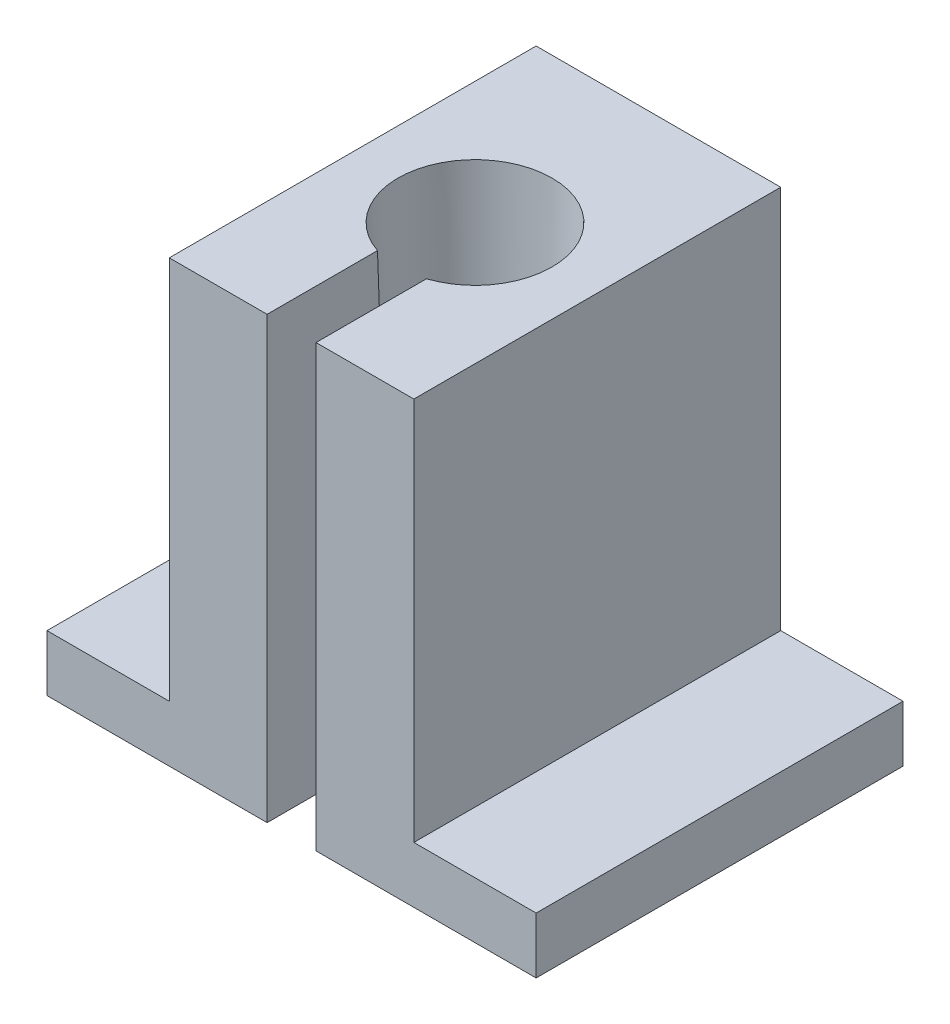
ISO-10303-21;
HEADER;
FILE_DESCRIPTION(('STEP AP214'),'2;1');
FILE_NAME('part.step','',(''),(''),'','','');
FILE_SCHEMA(('AUTOMOTIVE_DESIGN { 1 0 10303 214 1 1 1 1 }'));
ENDSEC;
DATA;
#1=APPLICATION_CONTEXT('core data for automotive mechanical design processes');
#2=APPLICATION_PROTOCOL_DEFINITION('international standard','automotive_design',2000,#1);
#3=PRODUCT_CONTEXT('',#1,'mechanical');
#4=PRODUCT('Part','Part','',(#3));
#5=PRODUCT_RELATED_PRODUCT_CATEGORY('part','',(#4));
#6=PRODUCT_DEFINITION_FORMATION('','',#4);
#7=PRODUCT_DEFINITION_CONTEXT('part definition',#1,'design');
#8=PRODUCT_DEFINITION('design','',#6,#7);
#9=PRODUCT_DEFINITION_SHAPE('','',#8);
#10=(LENGTH_UNIT() NAMED_UNIT(*) SI_UNIT(.MILLI.,.METRE.));
#11=(NAMED_UNIT(*) PLANE_ANGLE_UNIT() SI_UNIT($,.RADIAN.));
#12=(NAMED_UNIT(*) SI_UNIT($,.STERADIAN.) SOLID_ANGLE_UNIT());
#13=UNCERTAINTY_MEASURE_WITH_UNIT(LENGTH_MEASURE(1.E-05),#10,'distance_accuracy_value','');
#14=(GEOMETRIC_REPRESENTATION_CONTEXT(3) GLOBAL_UNCERTAINTY_ASSIGNED_CONTEXT((#13)) GLOBAL_UNIT_ASSIGNED_CONTEXT((#10,
#11,#12)) REPRESENTATION_CONTEXT('',''));
#15=CARTESIAN_POINT('',(0.,0.,0.));
#16=DIRECTION('',(0.,0.,1.));
#17=DIRECTION('',(1.,0.,0.));
#18=AXIS2_PLACEMENT_3D('',#15,#16,#17);
#19=CARTESIAN_POINT('',(0.,0.,15.));
#20=DIRECTION('',(0.,0.,1.));
#21=DIRECTION('',(1.,0.,0.));
#22=AXIS2_PLACEMENT_3D('',#19,#20,#21);
#23=PLANE('',#22);
#24=DIRECTION('',(0.,1.,0.));
#25=VECTOR('',#24,1.);
#26=CARTESIAN_POINT('',(1.,9.,15.));
#27=LINE('',#26,#25);
#28=CARTESIAN_POINT('',(1.,-9.,15.));
#29=VERTEX_POINT('',#28);
#30=CARTESIAN_POINT('',(1.,9.,15.));
#31=VERTEX_POINT('',#30);
#32=EDGE_CURVE('E135',#29,#31,#27,.T.);
#33=ORIENTED_EDGE('',*,*,#32,.F.);
#34=DIRECTION('',(1.,0.,0.));
#35=VECTOR('',#34,1.);
#36=CARTESIAN_POINT('',(-5.,-9.,15.));
#37=LINE('',#36,#35);
#38=CARTESIAN_POINT('',(10.,-9.,15.));
#39=VERTEX_POINT('',#38);
#40=EDGE_CURVE('E170',#29,#39,#37,.T.);
#41=ORIENTED_EDGE('',*,*,#40,.T.);
#42=DIRECTION('',(0.,1.,0.));
#43=VECTOR('',#42,1.);
#44=CARTESIAN_POINT('',(10.,-6.7,15.));
#45=LINE('',#44,#43);
#46=CARTESIAN_POINT('',(10.,-6.7,15.));
#47=VERTEX_POINT('',#46);
#48=EDGE_CURVE('E276',#39,#47,#45,.T.);
#49=ORIENTED_EDGE('',*,*,#48,.T.);
#50=DIRECTION('',(-1.,0.,0.));
#51=VECTOR('',#50,1.);
#52=CARTESIAN_POINT('',(5.,-6.7,15.));
#53=LINE('',#52,#51);
#54=CARTESIAN_POINT('',(5.,-6.7,15.));
#55=VERTEX_POINT('',#54);
#56=EDGE_CURVE('E322',#47,#55,#53,.T.);
#57=ORIENTED_EDGE('',*,*,#56,.T.);
#58=DIRECTION('',(0.,1.,0.));
#59=VECTOR('',#58,1.);
#60=CARTESIAN_POINT('',(5.,9.,15.));
#61=LINE('',#60,#59);
#62=CARTESIAN_POINT('',(5.,9.,15.));
#63=VERTEX_POINT('',#62);
#64=EDGE_CURVE('E162',#55,#63,#61,.T.);
#65=ORIENTED_EDGE('',*,*,#64,.T.);
#66=DIRECTION('',(-1.,0.,0.));
#67=VECTOR('',#66,1.);
#68=CARTESIAN_POINT('',(-5.,9.,15.));
#69=LINE('',#68,#67);
#70=EDGE_CURVE('E153',#63,#31,#69,.T.);
#71=ORIENTED_EDGE('',*,*,#70,.T.);
#72=EDGE_LOOP('',(#33,#41,#49,#57,#65,#71));
#73=FACE_BOUND('',#72,.T.);
#74=ADVANCED_FACE('F45',(#73),#23,.T.);
#75=CARTESIAN_POINT('',(5.,9.,15.));
#76=DIRECTION('',(-1.,0.,0.));
#77=DIRECTION('',(0.,0.,1.));
#78=AXIS2_PLACEMENT_3D('',#75,#76,#77);
#79=PLANE('',#78);
#80=DIRECTION('',(0.,0.,1.));
#81=VECTOR('',#80,1.);
#82=CARTESIAN_POINT('',(5.,-6.7,-5.50363516232681));
#83=LINE('',#82,#81);
#84=CARTESIAN_POINT('',(5.,-6.7,0.));
#85=VERTEX_POINT('',#84);
#86=EDGE_CURVE('E255',#85,#55,#83,.T.);
#87=ORIENTED_EDGE('',*,*,#86,.F.);
#88=DIRECTION('',(0.,1.,0.));
#89=VECTOR('',#88,1.);
#90=CARTESIAN_POINT('',(5.,9.,0.));
#91=LINE('',#90,#89);
#92=CARTESIAN_POINT('',(5.,9.,0.));
#93=VERTEX_POINT('',#92);
#94=EDGE_CURVE('E180',#85,#93,#91,.T.);
#95=ORIENTED_EDGE('',*,*,#94,.T.);
#96=DIRECTION('',(0.,0.,-1.));
#97=VECTOR('',#96,1.);
#98=CARTESIAN_POINT('',(5.,9.,15.));
#99=LINE('',#98,#97);
#100=EDGE_CURVE('E197',#63,#93,#99,.T.);
#101=ORIENTED_EDGE('',*,*,#100,.F.);
#102=ORIENTED_EDGE('',*,*,#64,.F.);
#103=EDGE_LOOP('',(#87,#95,#101,#102));
#104=FACE_BOUND('',#103,.T.);
#105=ADVANCED_FACE('F248',(#104),#79,.F.);
#106=CARTESIAN_POINT('',(-5.,9.,15.));
#107=DIRECTION('',(0.,-1.,0.));
#108=DIRECTION('',(0.,0.,-1.));
#109=AXIS2_PLACEMENT_3D('',#106,#107,#108);
#110=PLANE('',#109);
#111=CARTESIAN_POINT('',(0.,9.,7.50000000000005));
#112=DIRECTION('',(0.,-1.,0.));
#113=DIRECTION('',(0.,0.,-1.));
#114=AXIS2_PLACEMENT_3D('',#111,#112,#113);
#115=CIRCLE('',#114,3.15);
#116=CARTESIAN_POINT('',(-1.,9.,10.4870554062488));
#117=VERTEX_POINT('',#116);
#118=CARTESIAN_POINT('',(1.,9.,10.4870554062488));
#119=VERTEX_POINT('',#118);
#120=EDGE_CURVE('E157',#117,#119,#115,.T.);
#121=ORIENTED_EDGE('',*,*,#120,.T.);
#122=DIRECTION('',(0.,0.,1.));
#123=VECTOR('',#122,1.);
#124=CARTESIAN_POINT('',(1.,9.,7.));
#125=LINE('',#124,#123);
#126=EDGE_CURVE('E139',#119,#31,#125,.T.);
#127=ORIENTED_EDGE('',*,*,#126,.T.);
#128=ORIENTED_EDGE('',*,*,#70,.F.);
#129=ORIENTED_EDGE('',*,*,#100,.T.);
#130=DIRECTION('',(-1.,0.,0.));
#131=VECTOR('',#130,1.);
#132=CARTESIAN_POINT('',(-5.,9.,0.));
#133=LINE('',#132,#131);
#134=CARTESIAN_POINT('',(-5.,9.,0.));
#135=VERTEX_POINT('',#134);
#136=EDGE_CURVE('E183',#93,#135,#133,.T.);
#137=ORIENTED_EDGE('',*,*,#136,.T.);
#138=DIRECTION('',(0.,0.,-1.));
#139=VECTOR('',#138,1.);
#140=CARTESIAN_POINT('',(-5.,9.,15.));
#141=LINE('',#140,#139);
#142=CARTESIAN_POINT('',(-5.,9.,15.));
#143=VERTEX_POINT('',#142);
#144=EDGE_CURVE('E179',#143,#135,#141,.T.);
#145=ORIENTED_EDGE('',*,*,#144,.F.);
#146=CARTESIAN_POINT('',(-1.,9.,15.));
#147=VERTEX_POINT('',#146);
#148=EDGE_CURVE('E165',#147,#143,#69,.T.);
#149=ORIENTED_EDGE('',*,*,#148,.F.);
#150=DIRECTION('',(0.,0.,1.));
#151=VECTOR('',#150,1.);
#152=CARTESIAN_POINT('',(-1.,9.,7.));
#153=LINE('',#152,#151);
#154=EDGE_CURVE('E159',#117,#147,#153,.T.);
#155=ORIENTED_EDGE('',*,*,#154,.F.);
#156=EDGE_LOOP('',(#121,#127,#128,#129,#137,#145,#149,#155));
#157=FACE_BOUND('',#156,.T.);
#158=ADVANCED_FACE('F151',(#157),#110,.F.);
#159=CARTESIAN_POINT('',(-5.,9.,15.));
#160=DIRECTION('',(1.,0.,0.));
#161=DIRECTION('',(0.,0.,-1.));
#162=AXIS2_PLACEMENT_3D('',#159,#160,#161);
#163=PLANE('',#162);
#164=DIRECTION('',(0.,-1.,0.));
#165=VECTOR('',#164,1.);
#166=CARTESIAN_POINT('',(-5.,9.,0.));
#167=LINE('',#166,#165);
#168=CARTESIAN_POINT('',(-5.,-6.7,0.));
#169=VERTEX_POINT('',#168);
#170=EDGE_CURVE('E187',#135,#169,#167,.T.);
#171=ORIENTED_EDGE('',*,*,#170,.T.);
#172=DIRECTION('',(0.,0.,1.));
#173=VECTOR('',#172,1.);
#174=CARTESIAN_POINT('',(-5.,-6.7,-5.50363516232681));
#175=LINE('',#174,#173);
#176=CARTESIAN_POINT('',(-5.,-6.7,15.));
#177=VERTEX_POINT('',#176);
#178=EDGE_CURVE('E291',#169,#177,#175,.T.);
#179=ORIENTED_EDGE('',*,*,#178,.T.);
#180=DIRECTION('',(0.,-1.,0.));
#181=VECTOR('',#180,1.);
#182=CARTESIAN_POINT('',(-5.,9.,15.));
#183=LINE('',#182,#181);
#184=EDGE_CURVE('E164',#143,#177,#183,.T.);
#185=ORIENTED_EDGE('',*,*,#184,.F.);
#186=ORIENTED_EDGE('',*,*,#144,.T.);
#187=EDGE_LOOP('',(#171,#179,#185,#186));
#188=FACE_BOUND('',#187,.T.);
#189=ADVANCED_FACE('F242',(#188),#163,.F.);
#190=CARTESIAN_POINT('',(-5.,-9.,15.));
#191=DIRECTION('',(0.,1.,0.));
#192=DIRECTION('',(0.,0.,1.));
#193=AXIS2_PLACEMENT_3D('',#190,#191,#192);
#194=PLANE('',#193);
#195=ORIENTED_EDGE('',*,*,#40,.F.);
#196=DIRECTION('',(0.,0.,1.));
#197=VECTOR('',#196,1.);
#198=CARTESIAN_POINT('',(1.,-9.,7.));
#199=LINE('',#198,#197);
#200=CARTESIAN_POINT('',(1.,-9.,9.81464680364201));
#201=VERTEX_POINT('',#200);
#202=EDGE_CURVE('E141',#201,#29,#199,.T.);
#203=ORIENTED_EDGE('',*,*,#202,.F.);
#204=CARTESIAN_POINT('',(0.,-9.,7.50000000000005));
#205=DIRECTION('',(0.,1.,0.));
#206=DIRECTION('',(0.,0.,1.));
#207=AXIS2_PLACEMENT_3D('',#204,#205,#206);
#208=CIRCLE('',#207,2.52142614914854);
#209=CARTESIAN_POINT('',(-1.,-9.,9.81464680364201));
#210=VERTEX_POINT('',#209);
#211=EDGE_CURVE('E200',#210,#201,#208,.F.);
#212=ORIENTED_EDGE('',*,*,#211,.F.);
#213=DIRECTION('',(0.,0.,1.));
#214=VECTOR('',#213,1.);
#215=CARTESIAN_POINT('',(-1.,-9.,7.));
#216=LINE('',#215,#214);
#217=CARTESIAN_POINT('',(-1.,-9.,15.));
#218=VERTEX_POINT('',#217);
#219=EDGE_CURVE('E68',#210,#218,#216,.T.);
#220=ORIENTED_EDGE('',*,*,#219,.T.);
#221=CARTESIAN_POINT('',(-10.,-9.,15.));
#222=VERTEX_POINT('',#221);
#223=EDGE_CURVE('E175',#222,#218,#37,.T.);
#224=ORIENTED_EDGE('',*,*,#223,.F.);
#225=DIRECTION('',(0.,0.,1.));
#226=VECTOR('',#225,1.);
#227=CARTESIAN_POINT('',(-10.,-9.,-5.50363516232681));
#228=LINE('',#227,#226);
#229=CARTESIAN_POINT('',(-10.,-9.,0.));
#230=VERTEX_POINT('',#229);
#231=EDGE_CURVE('E282',#230,#222,#228,.T.);
#232=ORIENTED_EDGE('',*,*,#231,.F.);
#233=DIRECTION('',(1.,0.,0.));
#234=VECTOR('',#233,1.);
#235=CARTESIAN_POINT('',(-5.,-9.,0.));
#236=LINE('',#235,#234);
#237=CARTESIAN_POINT('',(10.,-9.,0.));
#238=VERTEX_POINT('',#237);
#239=EDGE_CURVE('E191',#230,#238,#236,.T.);
#240=ORIENTED_EDGE('',*,*,#239,.T.);
#241=DIRECTION('',(0.,0.,1.));
#242=VECTOR('',#241,1.);
#243=CARTESIAN_POINT('',(10.,-9.,-5.50363516232681));
#244=LINE('',#243,#242);
#245=EDGE_CURVE('E318',#238,#39,#244,.T.);
#246=ORIENTED_EDGE('',*,*,#245,.T.);
#247=EDGE_LOOP('',(#195,#203,#212,#220,#224,#232,#240,#246));
#248=FACE_BOUND('',#247,.T.);
#249=ADVANCED_FACE('F235',(#248),#194,.F.);
#250=DIRECTION('',(0.,-1.,0.));
#251=VECTOR('',#250,1.);
#252=CARTESIAN_POINT('',(-1.,9.,15.));
#253=LINE('',#252,#251);
#254=EDGE_CURVE('E146',#147,#218,#253,.T.);
#255=ORIENTED_EDGE('',*,*,#254,.F.);
#256=ORIENTED_EDGE('',*,*,#148,.T.);
#257=ORIENTED_EDGE('',*,*,#184,.T.);
#258=DIRECTION('',(-1.,0.,0.));
#259=VECTOR('',#258,1.);
#260=CARTESIAN_POINT('',(-5.,-6.7,15.));
#261=LINE('',#260,#259);
#262=CARTESIAN_POINT('',(-10.,-6.7,15.));
#263=VERTEX_POINT('',#262);
#264=EDGE_CURVE('E283',#177,#263,#261,.T.);
#265=ORIENTED_EDGE('',*,*,#264,.T.);
#266=DIRECTION('',(0.,-1.,0.));
#267=VECTOR('',#266,1.);
#268=CARTESIAN_POINT('',(-10.,-6.7,15.));
#269=LINE('',#268,#267);
#270=EDGE_CURVE('E287',#263,#222,#269,.T.);
#271=ORIENTED_EDGE('',*,*,#270,.T.);
#272=ORIENTED_EDGE('',*,*,#223,.T.);
#273=EDGE_LOOP('',(#255,#256,#257,#265,#271,#272));
#274=FACE_BOUND('',#273,.T.);
#275=ADVANCED_FACE('F232',(#274),#23,.T.);
#276=CARTESIAN_POINT('',(0.,0.,0.));
#277=DIRECTION('',(0.,0.,1.));
#278=DIRECTION('',(1.,0.,0.));
#279=AXIS2_PLACEMENT_3D('',#276,#277,#278);
#280=PLANE('',#279);
#281=ORIENTED_EDGE('',*,*,#94,.F.);
#282=DIRECTION('',(1.,0.,0.));
#283=VECTOR('',#282,1.);
#284=CARTESIAN_POINT('',(5.,-6.7,0.));
#285=LINE('',#284,#283);
#286=CARTESIAN_POINT('',(10.,-6.7,0.));
#287=VERTEX_POINT('',#286);
#288=EDGE_CURVE('E265',#85,#287,#285,.T.);
#289=ORIENTED_EDGE('',*,*,#288,.T.);
#290=DIRECTION('',(0.,-1.,0.));
#291=VECTOR('',#290,1.);
#292=CARTESIAN_POINT('',(10.,-6.7,0.));
#293=LINE('',#292,#291);
#294=EDGE_CURVE('E262',#287,#238,#293,.T.);
#295=ORIENTED_EDGE('',*,*,#294,.T.);
#296=ORIENTED_EDGE('',*,*,#239,.F.);
#297=DIRECTION('',(0.,1.,0.));
#298=VECTOR('',#297,1.);
#299=CARTESIAN_POINT('',(-10.,-6.7,0.));
#300=LINE('',#299,#298);
#301=CARTESIAN_POINT('',(-10.,-6.7,0.));
#302=VERTEX_POINT('',#301);
#303=EDGE_CURVE('E279',#230,#302,#300,.T.);
#304=ORIENTED_EDGE('',*,*,#303,.T.);
#305=DIRECTION('',(1.,0.,0.));
#306=VECTOR('',#305,1.);
#307=CARTESIAN_POINT('',(-5.,-6.7,0.));
#308=LINE('',#307,#306);
#309=EDGE_CURVE('E184',#302,#169,#308,.T.);
#310=ORIENTED_EDGE('',*,*,#309,.T.);
#311=ORIENTED_EDGE('',*,*,#170,.F.);
#312=ORIENTED_EDGE('',*,*,#136,.F.);
#313=EDGE_LOOP('',(#281,#289,#295,#296,#304,#310,#311,#312));
#314=FACE_BOUND('',#313,.T.);
#315=ADVANCED_FACE('F227',(#314),#280,.F.);
#316=CARTESIAN_POINT('',(-10.,-6.7,-5.50363516232681));
#317=DIRECTION('',(-1.,0.,0.));
#318=DIRECTION('',(0.,-1.,0.));
#319=AXIS2_PLACEMENT_3D('',#316,#317,#318);
#320=PLANE('',#319);
#321=ORIENTED_EDGE('',*,*,#303,.F.);
#322=ORIENTED_EDGE('',*,*,#231,.T.);
#323=ORIENTED_EDGE('',*,*,#270,.F.);
#324=DIRECTION('',(0.,0.,1.));
#325=VECTOR('',#324,1.);
#326=CARTESIAN_POINT('',(-10.,-6.7,-5.50363516232681));
#327=LINE('',#326,#325);
#328=EDGE_CURVE('E295',#302,#263,#327,.T.);
#329=ORIENTED_EDGE('',*,*,#328,.F.);
#330=EDGE_LOOP('',(#321,#322,#323,#329));
#331=FACE_BOUND('',#330,.T.);
#332=ADVANCED_FACE('F224',(#331),#320,.T.);
#333=CARTESIAN_POINT('',(-5.,-6.7,-5.50363516232681));
#334=DIRECTION('',(0.,1.,0.));
#335=DIRECTION('',(-1.,0.,0.));
#336=AXIS2_PLACEMENT_3D('',#333,#334,#335);
#337=PLANE('',#336);
#338=ORIENTED_EDGE('',*,*,#309,.F.);
#339=ORIENTED_EDGE('',*,*,#328,.T.);
#340=ORIENTED_EDGE('',*,*,#264,.F.);
#341=ORIENTED_EDGE('',*,*,#178,.F.);
#342=EDGE_LOOP('',(#338,#339,#340,#341));
#343=FACE_BOUND('',#342,.T.);
#344=ADVANCED_FACE('F222',(#343),#337,.T.);
#345=CARTESIAN_POINT('',(5.,-6.7,-5.50363516232681));
#346=DIRECTION('',(0.,1.,0.));
#347=DIRECTION('',(-1.,0.,0.));
#348=AXIS2_PLACEMENT_3D('',#345,#346,#347);
#349=PLANE('',#348);
#350=ORIENTED_EDGE('',*,*,#288,.F.);
#351=ORIENTED_EDGE('',*,*,#86,.T.);
#352=ORIENTED_EDGE('',*,*,#56,.F.);
#353=DIRECTION('',(0.,0.,1.));
#354=VECTOR('',#353,1.);
#355=CARTESIAN_POINT('',(10.,-6.7,-5.50363516232681));
#356=LINE('',#355,#354);
#357=EDGE_CURVE('E261',#287,#47,#356,.T.);
#358=ORIENTED_EDGE('',*,*,#357,.F.);
#359=EDGE_LOOP('',(#350,#351,#352,#358));
#360=FACE_BOUND('',#359,.T.);
#361=ADVANCED_FACE('F218',(#360),#349,.T.);
#362=CARTESIAN_POINT('',(10.,-6.7,-5.50363516232681));
#363=DIRECTION('',(1.,0.,0.));
#364=DIRECTION('',(0.,1.,0.));
#365=AXIS2_PLACEMENT_3D('',#362,#363,#364);
#366=PLANE('',#365);
#367=ORIENTED_EDGE('',*,*,#294,.F.);
#368=ORIENTED_EDGE('',*,*,#357,.T.);
#369=ORIENTED_EDGE('',*,*,#48,.F.);
#370=ORIENTED_EDGE('',*,*,#245,.F.);
#371=EDGE_LOOP('',(#367,#368,#369,#370));
#372=FACE_BOUND('',#371,.T.);
#373=ADVANCED_FACE('F215',(#372),#366,.T.);
#374=CARTESIAN_POINT('',(0.,9.,7.50000000000005));
#375=DIRECTION('',(0.,1.,0.));
#376=DIRECTION('',(0.,0.,-1.));
#377=AXIS2_PLACEMENT_3D('',#374,#375,#376);
#378=CONICAL_SURFACE('',#377,3.15,0.0349065850398867);
#379=ORIENTED_EDGE('',*,*,#211,.T.);
#380=CARTESIAN_POINT('',(1.,-9.,9.81464680364201));
#381=CARTESIAN_POINT('',(1.,-8.18845454480289,9.84551825941859));
#382=CARTESIAN_POINT('',(1.,-7.37690541976831,9.8762931067704));
#383=CARTESIAN_POINT('',(1.,-5.75380067881631,9.93767000039608));
#384=CARTESIAN_POINT('',(1.,-4.94224506289924,9.96827204667934));
#385=CARTESIAN_POINT('',(1.,-1.9422740298656,10.0811125674944));
#386=CARTESIAN_POINT('',(1.,0.246159356169794,10.1628732170288));
#387=CARTESIAN_POINT('',(1.,4.62305819243639,10.3255409129563));
#388=CARTESIAN_POINT('',(1.,6.81152364267229,10.4064479592235));
#389=CARTESIAN_POINT('',(1.,9.,10.4870554062488));
#390=B_SPLINE_CURVE_WITH_KNOTS('',3,(#380,#381,#382,#383,#384,#385,#386,#387,#388,#389),
.UNSPECIFIED.,.F.,.F.,(4,2,2,2,4),(0.,2.43639725585127,4.87279437911003,11.4426746403016,
18.012555871092),.UNSPECIFIED.);
#391=EDGE_CURVE('E11',#201,#119,#390,.T.);
#392=ORIENTED_EDGE('',*,*,#391,.T.);
#393=ORIENTED_EDGE('',*,*,#120,.F.);
#394=CARTESIAN_POINT('',(-1.,9.,10.4870554062488));
#395=CARTESIAN_POINT('',(-1.,7.98609593785696,10.4497177397669));
#396=CARTESIAN_POINT('',(-1.,6.97219446822892,10.4123097449531));
#397=CARTESIAN_POINT('',(-1.,4.94439743938858,10.3373354378966));
#398=CARTESIAN_POINT('',(-1.,3.93050188017593,10.2997691256626));
#399=CARTESIAN_POINT('',(-1.,0.930477551376087,10.18835312363));
#400=CARTESIAN_POINT('',(-1.,-1.05564196405654,10.1142537711723));
#401=CARTESIAN_POINT('',(-1.,-5.02784791415462,9.96516826140715));
#402=CARTESIAN_POINT('',(-1.,-7.01393434881641,9.89018210400219));
#403=CARTESIAN_POINT('',(-1.,-9.,9.81464680364205));
#404=B_SPLINE_CURVE_WITH_KNOTS('',3,(#394,#395,#396,#397,#398,#399,#400,#401,#402,#403),
.UNSPECIFIED.,.F.,.F.,(4,2,2,2,4),(0.,3.04377395366594,6.08754773812515,12.050051470194,
18.0125558579156),.UNSPECIFIED.);
#405=EDGE_CURVE('E61',#117,#210,#404,.T.);
#406=ORIENTED_EDGE('',*,*,#405,.T.);
#407=EDGE_LOOP('',(#379,#392,#393,#406));
#408=FACE_BOUND('',#407,.T.);
#409=ADVANCED_FACE('F47',(#408),#378,.F.);
#410=CARTESIAN_POINT('',(-1.,9.,7.));
#411=DIRECTION('',(-1.,0.,0.));
#412=DIRECTION('',(0.,0.,1.));
#413=AXIS2_PLACEMENT_3D('',#410,#411,#412);
#414=PLANE('',#413);
#415=ORIENTED_EDGE('',*,*,#154,.T.);
#416=ORIENTED_EDGE('',*,*,#254,.T.);
#417=ORIENTED_EDGE('',*,*,#219,.F.);
#418=ORIENTED_EDGE('',*,*,#405,.F.);
#419=EDGE_LOOP('',(#415,#416,#417,#418));
#420=FACE_BOUND('',#419,.T.);
#421=ADVANCED_FACE('F209',(#420),#414,.F.);
#422=CARTESIAN_POINT('',(1.,9.,7.));
#423=DIRECTION('',(1.,0.,0.));
#424=DIRECTION('',(0.,0.,-1.));
#425=AXIS2_PLACEMENT_3D('',#422,#423,#424);
#426=PLANE('',#425);
#427=ORIENTED_EDGE('',*,*,#202,.T.);
#428=ORIENTED_EDGE('',*,*,#32,.T.);
#429=ORIENTED_EDGE('',*,*,#126,.F.);
#430=ORIENTED_EDGE('',*,*,#391,.F.);
#431=EDGE_LOOP('',(#427,#428,#429,#430));
#432=FACE_BOUND('',#431,.T.);
#433=ADVANCED_FACE('F137',(#432),#426,.F.);
#434=CLOSED_SHELL('',(#74,#105,#158,#189,#249,#275,#315,#332,#344,#361,#373,#409,#421,#433));
#435=MANIFOLD_SOLID_BREP('B2',#434);
#436=ADVANCED_BREP_SHAPE_REPRESENTATION('',(#18,#435),#14);
#437=SHAPE_DEFINITION_REPRESENTATION(#9,#436);
ENDSEC;
END-ISO-10303-21;
